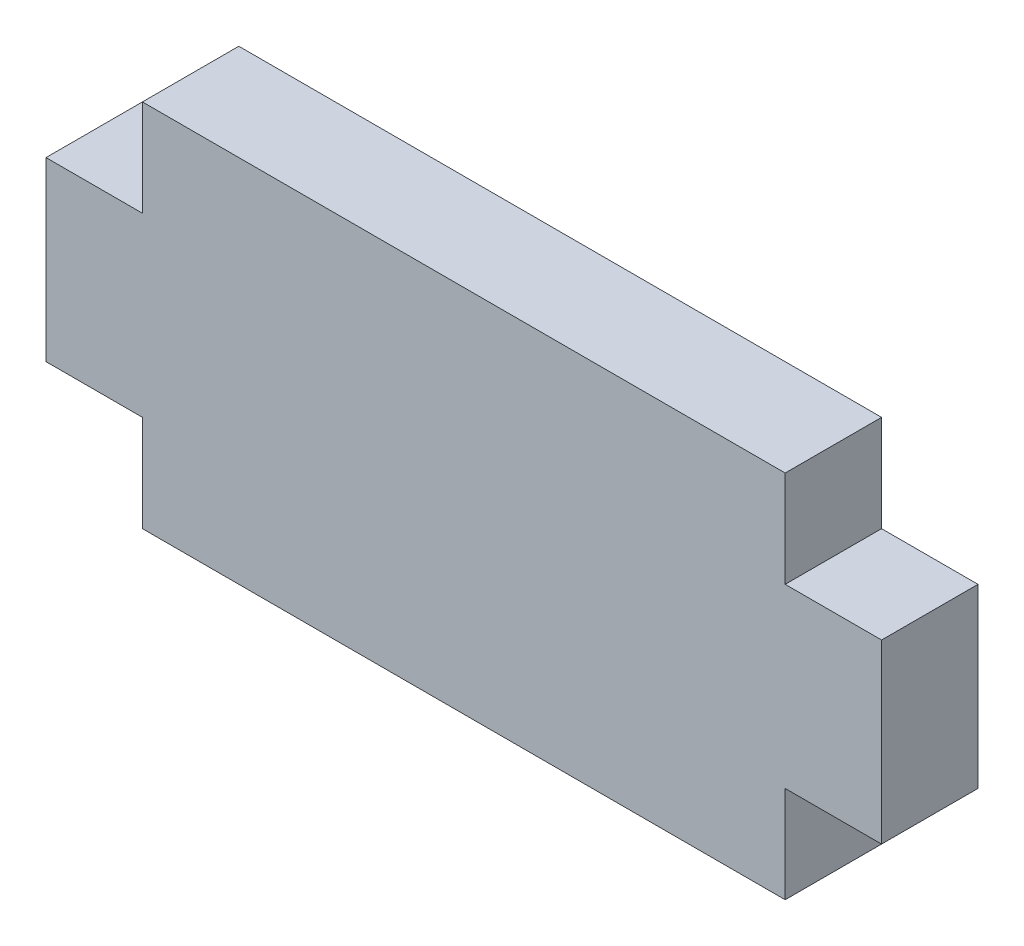
ISO-10303-21;
HEADER;
FILE_DESCRIPTION(('STEP AP214'),'2;1');
FILE_NAME('part.step','',(''),(''),'','','');
FILE_SCHEMA(('AUTOMOTIVE_DESIGN { 1 0 10303 214 1 1 1 1 }'));
ENDSEC;
DATA;
#1=APPLICATION_CONTEXT('core data for automotive mechanical design processes');
#2=APPLICATION_PROTOCOL_DEFINITION('international standard','automotive_design',2000,#1);
#3=PRODUCT_CONTEXT('',#1,'mechanical');
#4=PRODUCT('Part','Part','',(#3));
#5=PRODUCT_RELATED_PRODUCT_CATEGORY('part','',(#4));
#6=PRODUCT_DEFINITION_FORMATION('','',#4);
#7=PRODUCT_DEFINITION_CONTEXT('part definition',#1,'design');
#8=PRODUCT_DEFINITION('design','',#6,#7);
#9=PRODUCT_DEFINITION_SHAPE('','',#8);
#10=(LENGTH_UNIT() NAMED_UNIT(*) SI_UNIT(.MILLI.,.METRE.));
#11=(NAMED_UNIT(*) PLANE_ANGLE_UNIT() SI_UNIT($,.RADIAN.));
#12=(NAMED_UNIT(*) SI_UNIT($,.STERADIAN.) SOLID_ANGLE_UNIT());
#13=UNCERTAINTY_MEASURE_WITH_UNIT(LENGTH_MEASURE(1.E-05),#10,'distance_accuracy_value','');
#14=(GEOMETRIC_REPRESENTATION_CONTEXT(3) GLOBAL_UNCERTAINTY_ASSIGNED_CONTEXT((#13)) GLOBAL_UNIT_ASSIGNED_CONTEXT((#10,
#11,#12)) REPRESENTATION_CONTEXT('',''));
#15=CARTESIAN_POINT('',(0.,0.,0.));
#16=DIRECTION('',(0.,0.,1.));
#17=DIRECTION('',(1.,0.,0.));
#18=AXIS2_PLACEMENT_3D('',#15,#16,#17);
#19=CARTESIAN_POINT('',(0.,0.,6.));
#20=DIRECTION('',(1.,0.,0.));
#21=DIRECTION('',(0.,0.,-1.));
#22=AXIS2_PLACEMENT_3D('',#19,#20,#21);
#23=PLANE('',#22);
#24=DIRECTION('',(0.,-1.,0.));
#25=VECTOR('',#24,1.);
#26=CARTESIAN_POINT('',(0.,0.,0.));
#27=LINE('',#26,#25);
#28=CARTESIAN_POINT('',(0.,17.,0.));
#29=VERTEX_POINT('',#28);
#30=CARTESIAN_POINT('',(0.,6.,0.));
#31=VERTEX_POINT('',#30);
#32=EDGE_CURVE('E154',#29,#31,#27,.T.);
#33=ORIENTED_EDGE('',*,*,#32,.T.);
#34=DIRECTION('',(0.,0.,1.));
#35=VECTOR('',#34,1.);
#36=CARTESIAN_POINT('',(0.,6.,-4.));
#37=LINE('',#36,#35);
#38=CARTESIAN_POINT('',(0.,6.,6.));
#39=VERTEX_POINT('',#38);
#40=EDGE_CURVE('E215',#31,#39,#37,.T.);
#41=ORIENTED_EDGE('',*,*,#40,.T.);
#42=DIRECTION('',(0.,-1.,0.));
#43=VECTOR('',#42,1.);
#44=CARTESIAN_POINT('',(0.,0.,6.));
#45=LINE('',#44,#43);
#46=CARTESIAN_POINT('',(0.,17.,6.));
#47=VERTEX_POINT('',#46);
#48=EDGE_CURVE('E143',#47,#39,#45,.T.);
#49=ORIENTED_EDGE('',*,*,#48,.F.);
#50=DIRECTION('',(0.,0.,1.));
#51=VECTOR('',#50,1.);
#52=CARTESIAN_POINT('',(0.,17.,-4.));
#53=LINE('',#52,#51);
#54=EDGE_CURVE('E218',#29,#47,#53,.T.);
#55=ORIENTED_EDGE('',*,*,#54,.F.);
#56=EDGE_LOOP('',(#33,#41,#49,#55));
#57=FACE_BOUND('',#56,.T.);
#58=ADVANCED_FACE('F35',(#57),#23,.F.);
#59=CARTESIAN_POINT('',(0.,0.,6.));
#60=DIRECTION('',(0.,1.,0.));
#61=DIRECTION('',(0.,0.,1.));
#62=AXIS2_PLACEMENT_3D('',#59,#60,#61);
#63=PLANE('',#62);
#64=DIRECTION('',(1.,0.,0.));
#65=VECTOR('',#64,1.);
#66=CARTESIAN_POINT('',(0.,0.,6.));
#67=LINE('',#66,#65);
#68=CARTESIAN_POINT('',(6.,0.,6.));
#69=VERTEX_POINT('',#68);
#70=CARTESIAN_POINT('',(46.,0.,6.));
#71=VERTEX_POINT('',#70);
#72=EDGE_CURVE('E137',#69,#71,#67,.T.);
#73=ORIENTED_EDGE('',*,*,#72,.F.);
#74=DIRECTION('',(0.,0.,1.));
#75=VECTOR('',#74,1.);
#76=CARTESIAN_POINT('',(6.,0.,-4.));
#77=LINE('',#76,#75);
#78=CARTESIAN_POINT('',(6.,0.,0.));
#79=VERTEX_POINT('',#78);
#80=EDGE_CURVE('E120',#79,#69,#77,.T.);
#81=ORIENTED_EDGE('',*,*,#80,.F.);
#82=DIRECTION('',(1.,0.,0.));
#83=VECTOR('',#82,1.);
#84=CARTESIAN_POINT('',(0.,0.,0.));
#85=LINE('',#84,#83);
#86=CARTESIAN_POINT('',(46.,0.,0.));
#87=VERTEX_POINT('',#86);
#88=EDGE_CURVE('E157',#79,#87,#85,.T.);
#89=ORIENTED_EDGE('',*,*,#88,.T.);
#90=DIRECTION('',(0.,0.,1.));
#91=VECTOR('',#90,1.);
#92=CARTESIAN_POINT('',(46.,0.,-4.));
#93=LINE('',#92,#91);
#94=EDGE_CURVE('E138',#87,#71,#93,.T.);
#95=ORIENTED_EDGE('',*,*,#94,.T.);
#96=EDGE_LOOP('',(#73,#81,#89,#95));
#97=FACE_BOUND('',#96,.T.);
#98=ADVANCED_FACE('F141',(#97),#63,.F.);
#99=CARTESIAN_POINT('',(52.,0.,6.));
#100=DIRECTION('',(-1.,0.,0.));
#101=DIRECTION('',(0.,0.,1.));
#102=AXIS2_PLACEMENT_3D('',#99,#100,#101);
#103=PLANE('',#102);
#104=DIRECTION('',(0.,1.,0.));
#105=VECTOR('',#104,1.);
#106=CARTESIAN_POINT('',(52.,0.,6.));
#107=LINE('',#106,#105);
#108=CARTESIAN_POINT('',(52.,6.,6.));
#109=VERTEX_POINT('',#108);
#110=CARTESIAN_POINT('',(52.,17.,6.));
#111=VERTEX_POINT('',#110);
#112=EDGE_CURVE('E142',#109,#111,#107,.T.);
#113=ORIENTED_EDGE('',*,*,#112,.F.);
#114=DIRECTION('',(0.,0.,1.));
#115=VECTOR('',#114,1.);
#116=CARTESIAN_POINT('',(52.,6.,-4.));
#117=LINE('',#116,#115);
#118=CARTESIAN_POINT('',(52.,6.,0.));
#119=VERTEX_POINT('',#118);
#120=EDGE_CURVE('E187',#119,#109,#117,.T.);
#121=ORIENTED_EDGE('',*,*,#120,.F.);
#122=DIRECTION('',(0.,1.,0.));
#123=VECTOR('',#122,1.);
#124=CARTESIAN_POINT('',(52.,0.,0.));
#125=LINE('',#124,#123);
#126=CARTESIAN_POINT('',(52.,17.,0.));
#127=VERTEX_POINT('',#126);
#128=EDGE_CURVE('E160',#119,#127,#125,.T.);
#129=ORIENTED_EDGE('',*,*,#128,.T.);
#130=DIRECTION('',(0.,0.,1.));
#131=VECTOR('',#130,1.);
#132=CARTESIAN_POINT('',(52.,17.,-4.));
#133=LINE('',#132,#131);
#134=EDGE_CURVE('E206',#127,#111,#133,.T.);
#135=ORIENTED_EDGE('',*,*,#134,.T.);
#136=EDGE_LOOP('',(#113,#121,#129,#135));
#137=FACE_BOUND('',#136,.T.);
#138=ADVANCED_FACE('F191',(#137),#103,.F.);
#139=CARTESIAN_POINT('',(0.,23.,6.));
#140=DIRECTION('',(0.,-1.,0.));
#141=DIRECTION('',(0.,0.,-1.));
#142=AXIS2_PLACEMENT_3D('',#139,#140,#141);
#143=PLANE('',#142);
#144=DIRECTION('',(-1.,0.,0.));
#145=VECTOR('',#144,1.);
#146=CARTESIAN_POINT('',(0.,23.,6.));
#147=LINE('',#146,#145);
#148=CARTESIAN_POINT('',(46.,23.,6.));
#149=VERTEX_POINT('',#148);
#150=CARTESIAN_POINT('',(6.,23.,6.));
#151=VERTEX_POINT('',#150);
#152=EDGE_CURVE('E146',#149,#151,#147,.T.);
#153=ORIENTED_EDGE('',*,*,#152,.F.);
#154=DIRECTION('',(0.,0.,1.));
#155=VECTOR('',#154,1.);
#156=CARTESIAN_POINT('',(46.,23.,-4.));
#157=LINE('',#156,#155);
#158=CARTESIAN_POINT('',(46.,23.,0.));
#159=VERTEX_POINT('',#158);
#160=EDGE_CURVE('E205',#159,#149,#157,.T.);
#161=ORIENTED_EDGE('',*,*,#160,.F.);
#162=DIRECTION('',(-1.,0.,0.));
#163=VECTOR('',#162,1.);
#164=CARTESIAN_POINT('',(0.,23.,0.));
#165=LINE('',#164,#163);
#166=CARTESIAN_POINT('',(6.,23.,0.));
#167=VERTEX_POINT('',#166);
#168=EDGE_CURVE('E148',#159,#167,#165,.T.);
#169=ORIENTED_EDGE('',*,*,#168,.T.);
#170=DIRECTION('',(0.,0.,1.));
#171=VECTOR('',#170,1.);
#172=CARTESIAN_POINT('',(6.,23.,-4.));
#173=LINE('',#172,#171);
#174=EDGE_CURVE('E158',#167,#151,#173,.T.);
#175=ORIENTED_EDGE('',*,*,#174,.T.);
#176=EDGE_LOOP('',(#153,#161,#169,#175));
#177=FACE_BOUND('',#176,.T.);
#178=ADVANCED_FACE('F248',(#177),#143,.F.);
#179=CARTESIAN_POINT('',(0.,0.,6.));
#180=DIRECTION('',(0.,0.,-1.));
#181=DIRECTION('',(-1.,0.,0.));
#182=AXIS2_PLACEMENT_3D('',#179,#180,#181);
#183=PLANE('',#182);
#184=ORIENTED_EDGE('',*,*,#48,.T.);
#185=DIRECTION('',(-1.,0.,0.));
#186=VECTOR('',#185,1.);
#187=CARTESIAN_POINT('',(0.,6.,6.));
#188=LINE('',#187,#186);
#189=CARTESIAN_POINT('',(6.,6.,6.));
#190=VERTEX_POINT('',#189);
#191=EDGE_CURVE('E130',#190,#39,#188,.T.);
#192=ORIENTED_EDGE('',*,*,#191,.F.);
#193=DIRECTION('',(0.,1.,0.));
#194=VECTOR('',#193,1.);
#195=CARTESIAN_POINT('',(6.,0.,6.));
#196=LINE('',#195,#194);
#197=EDGE_CURVE('E123',#69,#190,#196,.T.);
#198=ORIENTED_EDGE('',*,*,#197,.F.);
#199=ORIENTED_EDGE('',*,*,#72,.T.);
#200=DIRECTION('',(0.,-1.,0.));
#201=VECTOR('',#200,1.);
#202=CARTESIAN_POINT('',(46.,0.,6.));
#203=LINE('',#202,#201);
#204=CARTESIAN_POINT('',(46.,6.,6.));
#205=VERTEX_POINT('',#204);
#206=EDGE_CURVE('E193',#205,#71,#203,.T.);
#207=ORIENTED_EDGE('',*,*,#206,.F.);
#208=DIRECTION('',(-1.,0.,0.));
#209=VECTOR('',#208,1.);
#210=CARTESIAN_POINT('',(52.,6.,6.));
#211=LINE('',#210,#209);
#212=EDGE_CURVE('E196',#109,#205,#211,.T.);
#213=ORIENTED_EDGE('',*,*,#212,.F.);
#214=ORIENTED_EDGE('',*,*,#112,.T.);
#215=DIRECTION('',(1.,0.,0.));
#216=VECTOR('',#215,1.);
#217=CARTESIAN_POINT('',(52.,17.,6.));
#218=LINE('',#217,#216);
#219=CARTESIAN_POINT('',(46.,17.,6.));
#220=VERTEX_POINT('',#219);
#221=EDGE_CURVE('E203',#220,#111,#218,.T.);
#222=ORIENTED_EDGE('',*,*,#221,.F.);
#223=DIRECTION('',(0.,-1.,0.));
#224=VECTOR('',#223,1.);
#225=CARTESIAN_POINT('',(46.,23.,6.));
#226=LINE('',#225,#224);
#227=EDGE_CURVE('E200',#149,#220,#226,.T.);
#228=ORIENTED_EDGE('',*,*,#227,.F.);
#229=ORIENTED_EDGE('',*,*,#152,.T.);
#230=DIRECTION('',(0.,1.,0.));
#231=VECTOR('',#230,1.);
#232=CARTESIAN_POINT('',(6.,23.,6.));
#233=LINE('',#232,#231);
#234=CARTESIAN_POINT('',(6.,17.,6.));
#235=VERTEX_POINT('',#234);
#236=EDGE_CURVE('E214',#235,#151,#233,.T.);
#237=ORIENTED_EDGE('',*,*,#236,.F.);
#238=DIRECTION('',(1.,0.,0.));
#239=VECTOR('',#238,1.);
#240=CARTESIAN_POINT('',(0.,17.,6.));
#241=LINE('',#240,#239);
#242=EDGE_CURVE('E211',#47,#235,#241,.T.);
#243=ORIENTED_EDGE('',*,*,#242,.F.);
#244=EDGE_LOOP('',(#184,#192,#198,#199,#207,#213,#214,#222,#228,#229,#237,#243));
#245=FACE_BOUND('',#244,.T.);
#246=ADVANCED_FACE('F135',(#245),#183,.F.);
#247=CARTESIAN_POINT('',(0.,0.,0.));
#248=DIRECTION('',(0.,0.,-1.));
#249=DIRECTION('',(-1.,0.,0.));
#250=AXIS2_PLACEMENT_3D('',#247,#248,#249);
#251=PLANE('',#250);
#252=DIRECTION('',(1.,0.,0.));
#253=VECTOR('',#252,1.);
#254=CARTESIAN_POINT('',(0.,6.,0.));
#255=LINE('',#254,#253);
#256=CARTESIAN_POINT('',(6.,6.,0.));
#257=VERTEX_POINT('',#256);
#258=EDGE_CURVE('E11',#31,#257,#255,.T.);
#259=ORIENTED_EDGE('',*,*,#258,.F.);
#260=ORIENTED_EDGE('',*,*,#32,.F.);
#261=DIRECTION('',(-1.,0.,0.));
#262=VECTOR('',#261,1.);
#263=CARTESIAN_POINT('',(0.,17.,0.));
#264=LINE('',#263,#262);
#265=CARTESIAN_POINT('',(6.,17.,0.));
#266=VERTEX_POINT('',#265);
#267=EDGE_CURVE('E153',#266,#29,#264,.T.);
#268=ORIENTED_EDGE('',*,*,#267,.F.);
#269=DIRECTION('',(0.,-1.,0.));
#270=VECTOR('',#269,1.);
#271=CARTESIAN_POINT('',(6.,0.,0.));
#272=LINE('',#271,#270);
#273=EDGE_CURVE('E165',#167,#266,#272,.T.);
#274=ORIENTED_EDGE('',*,*,#273,.F.);
#275=ORIENTED_EDGE('',*,*,#168,.F.);
#276=DIRECTION('',(0.,1.,0.));
#277=VECTOR('',#276,1.);
#278=CARTESIAN_POINT('',(46.,0.,0.));
#279=LINE('',#278,#277);
#280=CARTESIAN_POINT('',(46.,17.,0.));
#281=VERTEX_POINT('',#280);
#282=EDGE_CURVE('E168',#281,#159,#279,.T.);
#283=ORIENTED_EDGE('',*,*,#282,.F.);
#284=DIRECTION('',(-1.,0.,0.));
#285=VECTOR('',#284,1.);
#286=CARTESIAN_POINT('',(0.,17.,0.));
#287=LINE('',#286,#285);
#288=EDGE_CURVE('E170',#127,#281,#287,.T.);
#289=ORIENTED_EDGE('',*,*,#288,.F.);
#290=ORIENTED_EDGE('',*,*,#128,.F.);
#291=DIRECTION('',(1.,0.,0.));
#292=VECTOR('',#291,1.);
#293=CARTESIAN_POINT('',(0.,6.00000000000003,0.));
#294=LINE('',#293,#292);
#295=CARTESIAN_POINT('',(46.,6.,0.));
#296=VERTEX_POINT('',#295);
#297=EDGE_CURVE('E173',#296,#119,#294,.T.);
#298=ORIENTED_EDGE('',*,*,#297,.F.);
#299=DIRECTION('',(0.,1.,0.));
#300=VECTOR('',#299,1.);
#301=CARTESIAN_POINT('',(46.,0.,0.));
#302=LINE('',#301,#300);
#303=EDGE_CURVE('E175',#87,#296,#302,.T.);
#304=ORIENTED_EDGE('',*,*,#303,.F.);
#305=ORIENTED_EDGE('',*,*,#88,.F.);
#306=DIRECTION('',(0.,-1.,0.));
#307=VECTOR('',#306,1.);
#308=CARTESIAN_POINT('',(6.,0.,0.));
#309=LINE('',#308,#307);
#310=EDGE_CURVE('E42',#257,#79,#309,.T.);
#311=ORIENTED_EDGE('',*,*,#310,.F.);
#312=EDGE_LOOP('',(#259,#260,#268,#274,#275,#283,#289,#290,#298,#304,#305,#311));
#313=FACE_BOUND('',#312,.T.);
#314=ADVANCED_FACE('F183',(#313),#251,.T.);
#315=CARTESIAN_POINT('',(6.,23.,-4.));
#316=DIRECTION('',(1.,0.,0.));
#317=DIRECTION('',(0.,1.,0.));
#318=AXIS2_PLACEMENT_3D('',#315,#316,#317);
#319=PLANE('',#318);
#320=ORIENTED_EDGE('',*,*,#273,.T.);
#321=DIRECTION('',(0.,0.,1.));
#322=VECTOR('',#321,1.);
#323=CARTESIAN_POINT('',(6.,17.,-4.));
#324=LINE('',#323,#322);
#325=EDGE_CURVE('E221',#266,#235,#324,.T.);
#326=ORIENTED_EDGE('',*,*,#325,.T.);
#327=ORIENTED_EDGE('',*,*,#236,.T.);
#328=ORIENTED_EDGE('',*,*,#174,.F.);
#329=EDGE_LOOP('',(#320,#326,#327,#328));
#330=FACE_BOUND('',#329,.T.);
#331=ADVANCED_FACE('F252',(#330),#319,.F.);
#332=CARTESIAN_POINT('',(0.,17.,-4.));
#333=DIRECTION('',(0.,-1.,0.));
#334=DIRECTION('',(0.,0.,-1.));
#335=AXIS2_PLACEMENT_3D('',#332,#333,#334);
#336=PLANE('',#335);
#337=ORIENTED_EDGE('',*,*,#267,.T.);
#338=ORIENTED_EDGE('',*,*,#54,.T.);
#339=ORIENTED_EDGE('',*,*,#242,.T.);
#340=ORIENTED_EDGE('',*,*,#325,.F.);
#341=EDGE_LOOP('',(#337,#338,#339,#340));
#342=FACE_BOUND('',#341,.T.);
#343=ADVANCED_FACE('F225',(#342),#336,.F.);
#344=CARTESIAN_POINT('',(52.,17.,-4.));
#345=DIRECTION('',(0.,-1.,0.));
#346=DIRECTION('',(0.,0.,-1.));
#347=AXIS2_PLACEMENT_3D('',#344,#345,#346);
#348=PLANE('',#347);
#349=ORIENTED_EDGE('',*,*,#288,.T.);
#350=DIRECTION('',(0.,0.,1.));
#351=VECTOR('',#350,1.);
#352=CARTESIAN_POINT('',(46.,17.,-4.));
#353=LINE('',#352,#351);
#354=EDGE_CURVE('E208',#281,#220,#353,.T.);
#355=ORIENTED_EDGE('',*,*,#354,.T.);
#356=ORIENTED_EDGE('',*,*,#221,.T.);
#357=ORIENTED_EDGE('',*,*,#134,.F.);
#358=EDGE_LOOP('',(#349,#355,#356,#357));
#359=FACE_BOUND('',#358,.T.);
#360=ADVANCED_FACE('F241',(#359),#348,.F.);
#361=CARTESIAN_POINT('',(46.,23.,-4.));
#362=DIRECTION('',(-1.,0.,0.));
#363=DIRECTION('',(0.,0.,1.));
#364=AXIS2_PLACEMENT_3D('',#361,#362,#363);
#365=PLANE('',#364);
#366=ORIENTED_EDGE('',*,*,#282,.T.);
#367=ORIENTED_EDGE('',*,*,#160,.T.);
#368=ORIENTED_EDGE('',*,*,#227,.T.);
#369=ORIENTED_EDGE('',*,*,#354,.F.);
#370=EDGE_LOOP('',(#366,#367,#368,#369));
#371=FACE_BOUND('',#370,.T.);
#372=ADVANCED_FACE('F244',(#371),#365,.F.);
#373=CARTESIAN_POINT('',(46.,0.,-4.));
#374=DIRECTION('',(-1.,0.,0.));
#375=DIRECTION('',(0.,-1.,0.));
#376=AXIS2_PLACEMENT_3D('',#373,#374,#375);
#377=PLANE('',#376);
#378=ORIENTED_EDGE('',*,*,#303,.T.);
#379=DIRECTION('',(0.,0.,1.));
#380=VECTOR('',#379,1.);
#381=CARTESIAN_POINT('',(46.,6.,-4.));
#382=LINE('',#381,#380);
#383=EDGE_CURVE('E56',#296,#205,#382,.T.);
#384=ORIENTED_EDGE('',*,*,#383,.T.);
#385=ORIENTED_EDGE('',*,*,#206,.T.);
#386=ORIENTED_EDGE('',*,*,#94,.F.);
#387=EDGE_LOOP('',(#378,#384,#385,#386));
#388=FACE_BOUND('',#387,.T.);
#389=ADVANCED_FACE('F179',(#388),#377,.F.);
#390=CARTESIAN_POINT('',(52.,6.,-4.));
#391=DIRECTION('',(0.,1.,0.));
#392=DIRECTION('',(-1.,0.,0.));
#393=AXIS2_PLACEMENT_3D('',#390,#391,#392);
#394=PLANE('',#393);
#395=ORIENTED_EDGE('',*,*,#297,.T.);
#396=ORIENTED_EDGE('',*,*,#120,.T.);
#397=ORIENTED_EDGE('',*,*,#212,.T.);
#398=ORIENTED_EDGE('',*,*,#383,.F.);
#399=EDGE_LOOP('',(#395,#396,#397,#398));
#400=FACE_BOUND('',#399,.T.);
#401=ADVANCED_FACE('F186',(#400),#394,.F.);
#402=CARTESIAN_POINT('',(0.,6.,-4.));
#403=DIRECTION('',(0.,1.,0.));
#404=DIRECTION('',(-1.,0.,0.));
#405=AXIS2_PLACEMENT_3D('',#402,#403,#404);
#406=PLANE('',#405);
#407=ORIENTED_EDGE('',*,*,#258,.T.);
#408=DIRECTION('',(0.,0.,1.));
#409=VECTOR('',#408,1.);
#410=CARTESIAN_POINT('',(6.,6.,-4.));
#411=LINE('',#410,#409);
#412=EDGE_CURVE('E49',#257,#190,#411,.T.);
#413=ORIENTED_EDGE('',*,*,#412,.T.);
#414=ORIENTED_EDGE('',*,*,#191,.T.);
#415=ORIENTED_EDGE('',*,*,#40,.F.);
#416=EDGE_LOOP('',(#407,#413,#414,#415));
#417=FACE_BOUND('',#416,.T.);
#418=ADVANCED_FACE('F324',(#417),#406,.F.);
#419=CARTESIAN_POINT('',(6.,0.,-4.));
#420=DIRECTION('',(1.,0.,0.));
#421=DIRECTION('',(0.,1.,0.));
#422=AXIS2_PLACEMENT_3D('',#419,#420,#421);
#423=PLANE('',#422);
#424=ORIENTED_EDGE('',*,*,#310,.T.);
#425=ORIENTED_EDGE('',*,*,#80,.T.);
#426=ORIENTED_EDGE('',*,*,#197,.T.);
#427=ORIENTED_EDGE('',*,*,#412,.F.);
#428=EDGE_LOOP('',(#424,#425,#426,#427));
#429=FACE_BOUND('',#428,.T.);
#430=ADVANCED_FACE('F122',(#429),#423,.F.);
#431=CLOSED_SHELL('',(#58,#98,#138,#178,#246,#314,#331,#343,#360,#372,#389,#401,#418,#430));
#432=MANIFOLD_SOLID_BREP('B2',#431);
#433=ADVANCED_BREP_SHAPE_REPRESENTATION('',(#18,#432),#14);
#434=SHAPE_DEFINITION_REPRESENTATION(#9,#433);
ENDSEC;
END-ISO-10303-21;
